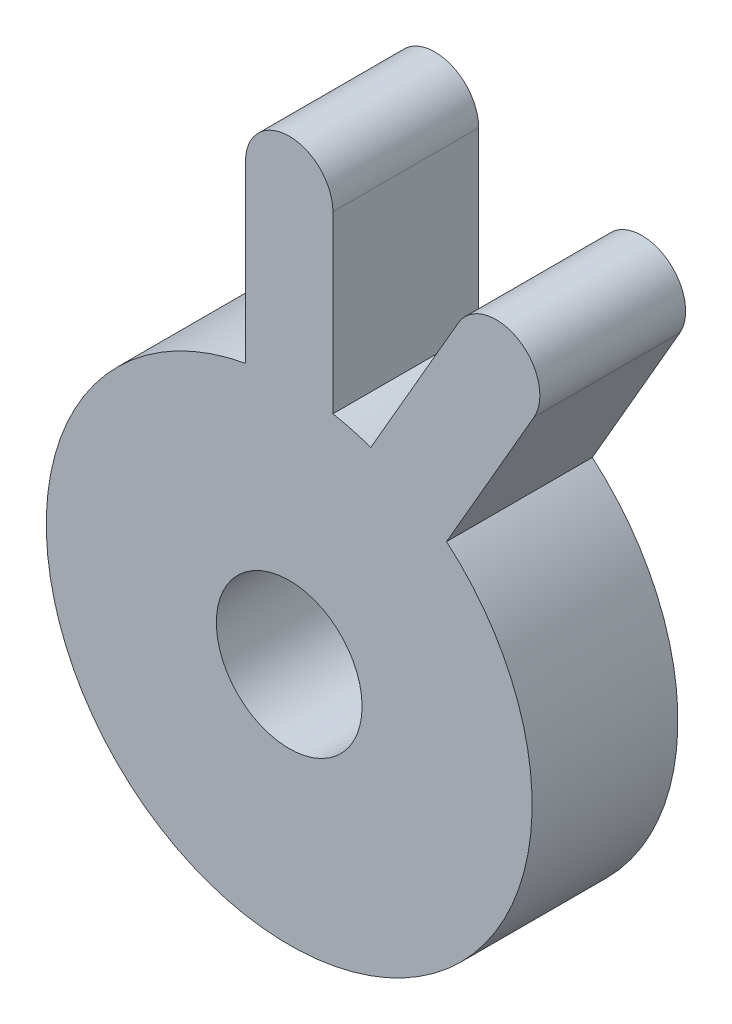
ISO-10303-21;
HEADER;
FILE_DESCRIPTION(('STEP AP214'),'2;1');
FILE_NAME('part.step','',(''),(''),'','','');
FILE_SCHEMA(('AUTOMOTIVE_DESIGN { 1 0 10303 214 1 1 1 1 }'));
ENDSEC;
DATA;
#1=APPLICATION_CONTEXT('core data for automotive mechanical design processes');
#2=APPLICATION_PROTOCOL_DEFINITION('international standard','automotive_design',2000,#1);
#3=PRODUCT_CONTEXT('',#1,'mechanical');
#4=PRODUCT('Part','Part','',(#3));
#5=PRODUCT_RELATED_PRODUCT_CATEGORY('part','',(#4));
#6=PRODUCT_DEFINITION_FORMATION('','',#4);
#7=PRODUCT_DEFINITION_CONTEXT('part definition',#1,'design');
#8=PRODUCT_DEFINITION('design','',#6,#7);
#9=PRODUCT_DEFINITION_SHAPE('','',#8);
#10=(LENGTH_UNIT() NAMED_UNIT(*) SI_UNIT(.MILLI.,.METRE.));
#11=(NAMED_UNIT(*) PLANE_ANGLE_UNIT() SI_UNIT($,.RADIAN.));
#12=(NAMED_UNIT(*) SI_UNIT($,.STERADIAN.) SOLID_ANGLE_UNIT());
#13=UNCERTAINTY_MEASURE_WITH_UNIT(LENGTH_MEASURE(1.E-05),#10,'distance_accuracy_value','');
#14=(GEOMETRIC_REPRESENTATION_CONTEXT(3) GLOBAL_UNCERTAINTY_ASSIGNED_CONTEXT((#13)) GLOBAL_UNIT_ASSIGNED_CONTEXT((#10,
#11,#12)) REPRESENTATION_CONTEXT('',''));
#15=CARTESIAN_POINT('',(0.,0.,0.));
#16=DIRECTION('',(0.,0.,1.));
#17=DIRECTION('',(1.,0.,0.));
#18=AXIS2_PLACEMENT_3D('',#15,#16,#17);
#19=CARTESIAN_POINT('',(0.,0.,15.));
#20=DIRECTION('',(0.,0.,-1.));
#21=DIRECTION('',(-1.,0.,0.));
#22=AXIS2_PLACEMENT_3D('',#19,#20,#21);
#23=CYLINDRICAL_SURFACE('',#22,25.);
#24=CARTESIAN_POINT('',(0.,0.,0.));
#25=DIRECTION('',(0.,0.,1.));
#26=DIRECTION('',(1.,0.,0.));
#27=AXIS2_PLACEMENT_3D('',#24,#25,#26);
#28=CIRCLE('',#27,25.);
#29=CARTESIAN_POINT('',(-4.5,24.5916652547159,0.));
#30=VERTEX_POINT('',#29);
#31=CARTESIAN_POINT('',(16.1929469443879,19.047006831947,0.));
#32=VERTEX_POINT('',#31);
#33=EDGE_CURVE('E136',#30,#32,#28,.T.);
#34=ORIENTED_EDGE('',*,*,#33,.T.);
#35=DIRECTION('',(0.,0.,-1.));
#36=VECTOR('',#35,1.);
#37=CARTESIAN_POINT('',(16.1929469443879,19.047006831947,15.));
#38=LINE('',#37,#36);
#39=CARTESIAN_POINT('',(16.1929469443879,19.047006831947,15.));
#40=VERTEX_POINT('',#39);
#41=EDGE_CURVE('E11',#40,#32,#38,.T.);
#42=ORIENTED_EDGE('',*,*,#41,.F.);
#43=CARTESIAN_POINT('',(0.,0.,15.));
#44=DIRECTION('',(0.,0.,1.));
#45=DIRECTION('',(1.,0.,0.));
#46=AXIS2_PLACEMENT_3D('',#43,#44,#45);
#47=CIRCLE('',#46,25.);
#48=CARTESIAN_POINT('',(-4.5,24.5916652547159,15.));
#49=VERTEX_POINT('',#48);
#50=EDGE_CURVE('E176',#49,#40,#47,.T.);
#51=ORIENTED_EDGE('',*,*,#50,.F.);
#52=DIRECTION('',(0.,0.,-1.));
#53=VECTOR('',#52,1.);
#54=CARTESIAN_POINT('',(-4.5,24.5916652547159,15.));
#55=LINE('',#54,#53);
#56=EDGE_CURVE('E51',#49,#30,#55,.T.);
#57=ORIENTED_EDGE('',*,*,#56,.T.);
#58=EDGE_LOOP('',(#34,#42,#51,#57));
#59=FACE_BOUND('',#58,.T.);
#60=ADVANCED_FACE('F34',(#59),#23,.T.);
#61=CARTESIAN_POINT('',(3.89711431702997,-2.25,15.));
#62=DIRECTION('',(-0.866025403784438,0.500000000000001,0.));
#63=DIRECTION('',(-0.500000000000001,-0.866025403784438,0.));
#64=AXIS2_PLACEMENT_3D('',#61,#62,#63);
#65=PLANE('',#64);
#66=DIRECTION('',(0.500000000000001,0.866025403784438,0.));
#67=VECTOR('',#66,1.);
#68=CARTESIAN_POINT('',(3.89711431702997,-2.25,0.));
#69=LINE('',#68,#67);
#70=CARTESIAN_POINT('',(25.192946944388,34.6354641000669,0.));
#71=VERTEX_POINT('',#70);
#72=EDGE_CURVE('E138',#32,#71,#69,.T.);
#73=ORIENTED_EDGE('',*,*,#72,.T.);
#74=DIRECTION('',(0.,0.,-1.));
#75=VECTOR('',#74,1.);
#76=CARTESIAN_POINT('',(25.192946944388,34.6354641000669,15.));
#77=LINE('',#76,#75);
#78=CARTESIAN_POINT('',(25.192946944388,34.6354641000669,15.));
#79=VERTEX_POINT('',#78);
#80=EDGE_CURVE('E43',#79,#71,#77,.T.);
#81=ORIENTED_EDGE('',*,*,#80,.F.);
#82=DIRECTION('',(0.500000000000001,0.866025403784438,0.));
#83=VECTOR('',#82,1.);
#84=CARTESIAN_POINT('',(3.89711431702997,-2.25,15.));
#85=LINE('',#84,#83);
#86=EDGE_CURVE('E89',#40,#79,#85,.T.);
#87=ORIENTED_EDGE('',*,*,#86,.F.);
#88=ORIENTED_EDGE('',*,*,#41,.T.);
#89=EDGE_LOOP('',(#73,#81,#87,#88));
#90=FACE_BOUND('',#89,.T.);
#91=ADVANCED_FACE('F196',(#90),#65,.F.);
#92=CARTESIAN_POINT('',(21.295832627358,36.8854641000669,15.));
#93=DIRECTION('',(0.,0.,-1.));
#94=DIRECTION('',(-1.,0.,0.));
#95=AXIS2_PLACEMENT_3D('',#92,#93,#94);
#96=CYLINDRICAL_SURFACE('',#95,4.50000000000005);
#97=CARTESIAN_POINT('',(21.295832627358,36.8854641000669,0.));
#98=DIRECTION('',(0.,0.,1.));
#99=DIRECTION('',(1.,0.,0.));
#100=AXIS2_PLACEMENT_3D('',#97,#98,#99);
#101=CIRCLE('',#100,4.50000000000005);
#102=CARTESIAN_POINT('',(17.3987183103279,39.135464100067,0.));
#103=VERTEX_POINT('',#102);
#104=EDGE_CURVE('E141',#71,#103,#101,.T.);
#105=ORIENTED_EDGE('',*,*,#104,.T.);
#106=DIRECTION('',(0.,0.,-1.));
#107=VECTOR('',#106,1.);
#108=CARTESIAN_POINT('',(17.3987183103279,39.135464100067,15.));
#109=LINE('',#108,#107);
#110=CARTESIAN_POINT('',(17.3987183103279,39.135464100067,15.));
#111=VERTEX_POINT('',#110);
#112=EDGE_CURVE('E159',#111,#103,#109,.T.);
#113=ORIENTED_EDGE('',*,*,#112,.F.);
#114=CARTESIAN_POINT('',(21.295832627358,36.8854641000669,15.));
#115=DIRECTION('',(0.,0.,1.));
#116=DIRECTION('',(1.,0.,0.));
#117=AXIS2_PLACEMENT_3D('',#114,#115,#116);
#118=CIRCLE('',#117,4.50000000000005);
#119=EDGE_CURVE('E166',#79,#111,#118,.T.);
#120=ORIENTED_EDGE('',*,*,#119,.F.);
#121=ORIENTED_EDGE('',*,*,#80,.T.);
#122=EDGE_LOOP('',(#105,#113,#120,#121));
#123=FACE_BOUND('',#122,.T.);
#124=ADVANCED_FACE('F164',(#123),#96,.T.);
#125=CARTESIAN_POINT('',(-3.89711431702986,2.24999999999991,15.));
#126=DIRECTION('',(-0.866025403784441,0.499999999999996,0.));
#127=DIRECTION('',(-0.499999999999996,-0.866025403784441,0.));
#128=AXIS2_PLACEMENT_3D('',#125,#126,#127);
#129=PLANE('',#128);
#130=DIRECTION('',(0.499999999999996,0.866025403784441,0.));
#131=VECTOR('',#130,1.);
#132=CARTESIAN_POINT('',(-3.89711431702986,2.24999999999991,0.));
#133=LINE('',#132,#131);
#134=CARTESIAN_POINT('',(8.39871831032799,23.5470068319471,0.));
#135=VERTEX_POINT('',#134);
#136=EDGE_CURVE('E144',#135,#103,#133,.T.);
#137=ORIENTED_EDGE('',*,*,#136,.F.);
#138=DIRECTION('',(0.,0.,-1.));
#139=VECTOR('',#138,1.);
#140=CARTESIAN_POINT('',(8.39871831032799,23.5470068319471,15.));
#141=LINE('',#140,#139);
#142=CARTESIAN_POINT('',(8.39871831032799,23.5470068319471,15.));
#143=VERTEX_POINT('',#142);
#144=EDGE_CURVE('E157',#143,#135,#141,.T.);
#145=ORIENTED_EDGE('',*,*,#144,.F.);
#146=DIRECTION('',(0.499999999999996,0.866025403784441,0.));
#147=VECTOR('',#146,1.);
#148=CARTESIAN_POINT('',(-3.89711431702986,2.24999999999991,15.));
#149=LINE('',#148,#147);
#150=EDGE_CURVE('E174',#143,#111,#149,.T.);
#151=ORIENTED_EDGE('',*,*,#150,.T.);
#152=ORIENTED_EDGE('',*,*,#112,.T.);
#153=EDGE_LOOP('',(#137,#145,#151,#152));
#154=FACE_BOUND('',#153,.T.);
#155=ADVANCED_FACE('F172',(#154),#129,.T.);
#156=CARTESIAN_POINT('',(4.5,24.5916652547159,0.));
#157=VERTEX_POINT('',#156);
#158=EDGE_CURVE('E139',#135,#157,#28,.T.);
#159=ORIENTED_EDGE('',*,*,#158,.T.);
#160=DIRECTION('',(0.,0.,-1.));
#161=VECTOR('',#160,1.);
#162=CARTESIAN_POINT('',(4.5,24.5916652547159,15.));
#163=LINE('',#162,#161);
#164=CARTESIAN_POINT('',(4.5,24.5916652547159,15.));
#165=VERTEX_POINT('',#164);
#166=EDGE_CURVE('E125',#165,#157,#163,.T.);
#167=ORIENTED_EDGE('',*,*,#166,.F.);
#168=EDGE_CURVE('E113',#143,#165,#47,.T.);
#169=ORIENTED_EDGE('',*,*,#168,.F.);
#170=ORIENTED_EDGE('',*,*,#144,.T.);
#171=EDGE_LOOP('',(#159,#167,#169,#170));
#172=FACE_BOUND('',#171,.T.);
#173=ADVANCED_FACE('F198',(#172),#23,.T.);
#174=CARTESIAN_POINT('',(4.49999999999986,0.,15.));
#175=DIRECTION('',(-1.,0.,0.));
#176=DIRECTION('',(0.,-1.,0.));
#177=AXIS2_PLACEMENT_3D('',#174,#175,#176);
#178=PLANE('',#177);
#179=DIRECTION('',(0.,1.,0.));
#180=VECTOR('',#179,1.);
#181=CARTESIAN_POINT('',(4.49999999999986,0.,0.));
#182=LINE('',#181,#180);
#183=CARTESIAN_POINT('',(4.5000000000001,42.5916652547159,0.));
#184=VERTEX_POINT('',#183);
#185=EDGE_CURVE('E122',#157,#184,#182,.T.);
#186=ORIENTED_EDGE('',*,*,#185,.T.);
#187=DIRECTION('',(0.,0.,-1.));
#188=VECTOR('',#187,1.);
#189=CARTESIAN_POINT('',(4.5000000000001,42.5916652547159,15.));
#190=LINE('',#189,#188);
#191=CARTESIAN_POINT('',(4.5000000000001,42.5916652547159,15.));
#192=VERTEX_POINT('',#191);
#193=EDGE_CURVE('E119',#192,#184,#190,.T.);
#194=ORIENTED_EDGE('',*,*,#193,.F.);
#195=DIRECTION('',(0.,1.,0.));
#196=VECTOR('',#195,1.);
#197=CARTESIAN_POINT('',(4.49999999999986,0.,15.));
#198=LINE('',#197,#196);
#199=EDGE_CURVE('E105',#165,#192,#198,.T.);
#200=ORIENTED_EDGE('',*,*,#199,.F.);
#201=ORIENTED_EDGE('',*,*,#166,.T.);
#202=EDGE_LOOP('',(#186,#194,#200,#201));
#203=FACE_BOUND('',#202,.T.);
#204=ADVANCED_FACE('F120',(#203),#178,.F.);
#205=CARTESIAN_POINT('',(0.,42.5916652547159,15.));
#206=DIRECTION('',(0.,0.,-1.));
#207=DIRECTION('',(-1.,0.,0.));
#208=AXIS2_PLACEMENT_3D('',#205,#206,#207);
#209=CYLINDRICAL_SURFACE('',#208,4.50000000000005);
#210=CARTESIAN_POINT('',(0.,42.5916652547159,0.));
#211=DIRECTION('',(0.,0.,1.));
#212=DIRECTION('',(1.,0.,0.));
#213=AXIS2_PLACEMENT_3D('',#210,#211,#212);
#214=CIRCLE('',#213,4.50000000000005);
#215=CARTESIAN_POINT('',(-4.5,42.5916652547159,0.));
#216=VERTEX_POINT('',#215);
#217=EDGE_CURVE('E148',#216,#184,#214,.F.);
#218=ORIENTED_EDGE('',*,*,#217,.F.);
#219=DIRECTION('',(0.,0.,-1.));
#220=VECTOR('',#219,1.);
#221=CARTESIAN_POINT('',(-4.5,42.5916652547159,15.));
#222=LINE('',#221,#220);
#223=CARTESIAN_POINT('',(-4.5,42.5916652547159,15.));
#224=VERTEX_POINT('',#223);
#225=EDGE_CURVE('E77',#224,#216,#222,.T.);
#226=ORIENTED_EDGE('',*,*,#225,.F.);
#227=CARTESIAN_POINT('',(0.,42.5916652547159,15.));
#228=DIRECTION('',(0.,0.,1.));
#229=DIRECTION('',(1.,0.,0.));
#230=AXIS2_PLACEMENT_3D('',#227,#228,#229);
#231=CIRCLE('',#230,4.50000000000005);
#232=EDGE_CURVE('E110',#224,#192,#231,.F.);
#233=ORIENTED_EDGE('',*,*,#232,.T.);
#234=ORIENTED_EDGE('',*,*,#193,.T.);
#235=EDGE_LOOP('',(#218,#226,#233,#234));
#236=FACE_BOUND('',#235,.T.);
#237=ADVANCED_FACE('F127',(#236),#209,.T.);
#238=CARTESIAN_POINT('',(0.,0.,15.));
#239=DIRECTION('',(0.,0.,-1.));
#240=DIRECTION('',(-1.,0.,0.));
#241=AXIS2_PLACEMENT_3D('',#238,#239,#240);
#242=CYLINDRICAL_SURFACE('',#241,7.5);
#243=CARTESIAN_POINT('',(0.,0.,15.));
#244=DIRECTION('',(0.,0.,1.));
#245=DIRECTION('',(1.,0.,0.));
#246=AXIS2_PLACEMENT_3D('',#243,#244,#245);
#247=CIRCLE('',#246,7.5);
#248=CARTESIAN_POINT('',(7.5,0.,15.));
#249=VERTEX_POINT('',#248);
#250=EDGE_CURVE('E153',#249,#249,#247,.T.);
#251=ORIENTED_EDGE('',*,*,#250,.T.);
#252=EDGE_LOOP('',(#251));
#253=FACE_BOUND('',#252,.T.);
#254=CARTESIAN_POINT('',(0.,0.,0.));
#255=DIRECTION('',(0.,0.,1.));
#256=DIRECTION('',(1.,0.,0.));
#257=AXIS2_PLACEMENT_3D('',#254,#255,#256);
#258=CIRCLE('',#257,7.5);
#259=CARTESIAN_POINT('',(7.5,0.,0.));
#260=VERTEX_POINT('',#259);
#261=EDGE_CURVE('E133',#260,#260,#258,.T.);
#262=ORIENTED_EDGE('',*,*,#261,.F.);
#263=EDGE_LOOP('',(#262));
#264=FACE_BOUND('',#263,.T.);
#265=ADVANCED_FACE('F36',(#253,#264),#242,.F.);
#266=CARTESIAN_POINT('',(-4.5,0.,15.));
#267=DIRECTION('',(-1.,0.,0.));
#268=DIRECTION('',(0.,-1.,0.));
#269=AXIS2_PLACEMENT_3D('',#266,#267,#268);
#270=PLANE('',#269);
#271=DIRECTION('',(0.,1.,0.));
#272=VECTOR('',#271,1.);
#273=CARTESIAN_POINT('',(-4.5,0.,0.));
#274=LINE('',#273,#272);
#275=EDGE_CURVE('E150',#30,#216,#274,.T.);
#276=ORIENTED_EDGE('',*,*,#275,.F.);
#277=ORIENTED_EDGE('',*,*,#56,.F.);
#278=DIRECTION('',(0.,1.,0.));
#279=VECTOR('',#278,1.);
#280=CARTESIAN_POINT('',(-4.5,0.,15.));
#281=LINE('',#280,#279);
#282=EDGE_CURVE('E128',#49,#224,#281,.T.);
#283=ORIENTED_EDGE('',*,*,#282,.T.);
#284=ORIENTED_EDGE('',*,*,#225,.T.);
#285=EDGE_LOOP('',(#276,#277,#283,#284));
#286=FACE_BOUND('',#285,.T.);
#287=ADVANCED_FACE('F186',(#286),#270,.T.);
#288=CARTESIAN_POINT('',(0.,0.,15.));
#289=DIRECTION('',(0.,0.,1.));
#290=DIRECTION('',(1.,0.,0.));
#291=AXIS2_PLACEMENT_3D('',#288,#289,#290);
#292=PLANE('',#291);
#293=ORIENTED_EDGE('',*,*,#250,.F.);
#294=EDGE_LOOP('',(#293));
#295=FACE_BOUND('',#294,.T.);
#296=ORIENTED_EDGE('',*,*,#50,.T.);
#297=ORIENTED_EDGE('',*,*,#86,.T.);
#298=ORIENTED_EDGE('',*,*,#119,.T.);
#299=ORIENTED_EDGE('',*,*,#150,.F.);
#300=ORIENTED_EDGE('',*,*,#168,.T.);
#301=ORIENTED_EDGE('',*,*,#199,.T.);
#302=ORIENTED_EDGE('',*,*,#232,.F.);
#303=ORIENTED_EDGE('',*,*,#282,.F.);
#304=EDGE_LOOP('',(#296,#297,#298,#299,#300,#301,#302,#303));
#305=FACE_BOUND('',#304,.T.);
#306=ADVANCED_FACE('F107',(#295,#305),#292,.T.);
#307=CARTESIAN_POINT('',(0.,0.,0.));
#308=DIRECTION('',(0.,0.,1.));
#309=DIRECTION('',(1.,0.,0.));
#310=AXIS2_PLACEMENT_3D('',#307,#308,#309);
#311=PLANE('',#310);
#312=ORIENTED_EDGE('',*,*,#261,.T.);
#313=EDGE_LOOP('',(#312));
#314=FACE_BOUND('',#313,.T.);
#315=ORIENTED_EDGE('',*,*,#33,.F.);
#316=ORIENTED_EDGE('',*,*,#275,.T.);
#317=ORIENTED_EDGE('',*,*,#217,.T.);
#318=ORIENTED_EDGE('',*,*,#185,.F.);
#319=ORIENTED_EDGE('',*,*,#158,.F.);
#320=ORIENTED_EDGE('',*,*,#136,.T.);
#321=ORIENTED_EDGE('',*,*,#104,.F.);
#322=ORIENTED_EDGE('',*,*,#72,.F.);
#323=EDGE_LOOP('',(#315,#316,#317,#318,#319,#320,#321,#322));
#324=FACE_BOUND('',#323,.T.);
#325=ADVANCED_FACE('F168',(#314,#324),#311,.F.);
#326=CLOSED_SHELL('',(#60,#91,#124,#155,#173,#204,#237,#265,#287,#306,#325));
#327=MANIFOLD_SOLID_BREP('B2',#326);
#328=ADVANCED_BREP_SHAPE_REPRESENTATION('',(#18,#327),#14);
#329=SHAPE_DEFINITION_REPRESENTATION(#9,#328);
ENDSEC;
END-ISO-10303-21;
